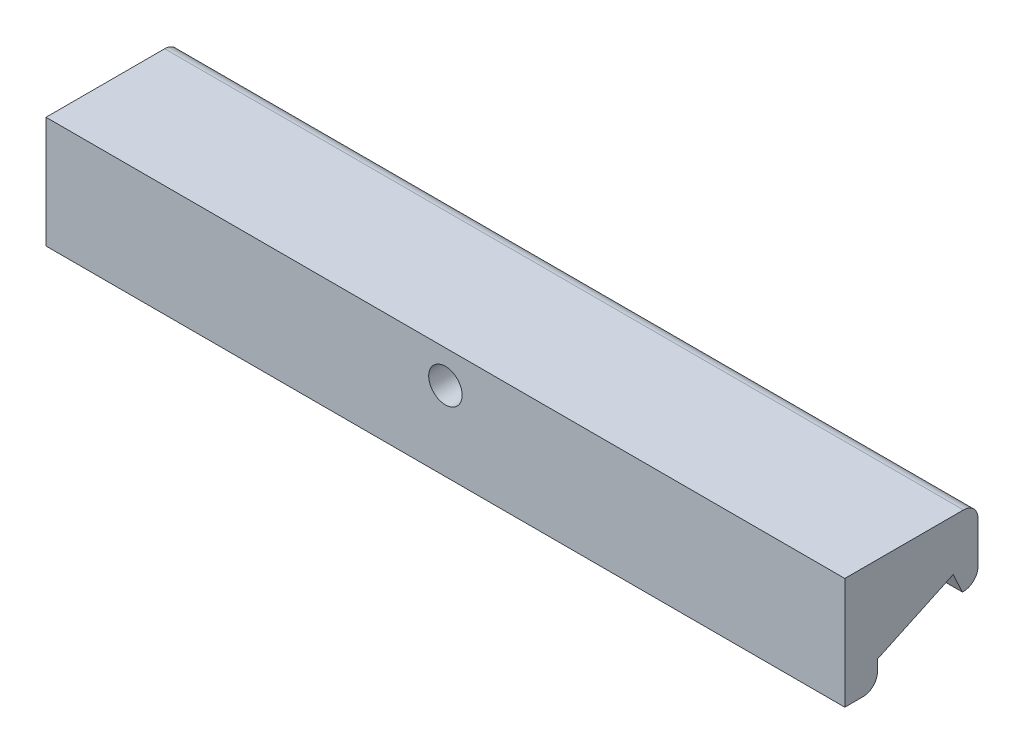
ISO-10303-21;
HEADER;
FILE_DESCRIPTION(('STEP AP214'),'2;1');
FILE_NAME('part.step','',(''),(''),'','','');
FILE_SCHEMA(('AUTOMOTIVE_DESIGN { 1 0 10303 214 1 1 1 1 }'));
ENDSEC;
DATA;
#1=APPLICATION_CONTEXT('core data for automotive mechanical design processes');
#2=APPLICATION_PROTOCOL_DEFINITION('international standard','automotive_design',2000,#1);
#3=PRODUCT_CONTEXT('',#1,'mechanical');
#4=PRODUCT('Part','Part','',(#3));
#5=PRODUCT_RELATED_PRODUCT_CATEGORY('part','',(#4));
#6=PRODUCT_DEFINITION_FORMATION('','',#4);
#7=PRODUCT_DEFINITION_CONTEXT('part definition',#1,'design');
#8=PRODUCT_DEFINITION('design','',#6,#7);
#9=PRODUCT_DEFINITION_SHAPE('','',#8);
#10=(LENGTH_UNIT() NAMED_UNIT(*) SI_UNIT(.MILLI.,.METRE.));
#11=(NAMED_UNIT(*) PLANE_ANGLE_UNIT() SI_UNIT($,.RADIAN.));
#12=(NAMED_UNIT(*) SI_UNIT($,.STERADIAN.) SOLID_ANGLE_UNIT());
#13=UNCERTAINTY_MEASURE_WITH_UNIT(LENGTH_MEASURE(1.E-05),#10,'distance_accuracy_value','');
#14=(GEOMETRIC_REPRESENTATION_CONTEXT(3) GLOBAL_UNCERTAINTY_ASSIGNED_CONTEXT((#13)) GLOBAL_UNIT_ASSIGNED_CONTEXT((#10,
#11,#12)) REPRESENTATION_CONTEXT('',''));
#15=CARTESIAN_POINT('',(0.,0.,0.));
#16=DIRECTION('',(0.,0.,1.));
#17=DIRECTION('',(1.,0.,0.));
#18=AXIS2_PLACEMENT_3D('',#15,#16,#17);
#19=CARTESIAN_POINT('',(110.,15.360110010018,0.));
#20=DIRECTION('',(0.,0.,-1.));
#21=DIRECTION('',(0.,1.,0.));
#22=AXIS2_PLACEMENT_3D('',#19,#20,#21);
#23=PLANE('',#22);
#24=CARTESIAN_POINT('',(55.,10.860110010018,0.));
#25=DIRECTION('',(0.,0.,1.));
#26=DIRECTION('',(1.,0.,0.));
#27=AXIS2_PLACEMENT_3D('',#24,#25,#26);
#28=CIRCLE('',#27,2.3);
#29=CARTESIAN_POINT('',(57.3,10.860110010018,0.));
#30=VERTEX_POINT('',#29);
#31=EDGE_CURVE('E212',#30,#30,#28,.T.);
#32=ORIENTED_EDGE('',*,*,#31,.F.);
#33=EDGE_LOOP('',(#32));
#34=FACE_BOUND('',#33,.T.);
#35=DIRECTION('',(0.,-1.,0.));
#36=VECTOR('',#35,1.);
#37=CARTESIAN_POINT('',(0.,15.360110010018,0.));
#38=LINE('',#37,#36);
#39=CARTESIAN_POINT('',(0.,15.360110010018,0.));
#40=VERTEX_POINT('',#39);
#41=CARTESIAN_POINT('',(0.,0.,0.));
#42=VERTEX_POINT('',#41);
#43=EDGE_CURVE('E146',#40,#42,#38,.T.);
#44=ORIENTED_EDGE('',*,*,#43,.T.);
#45=DIRECTION('',(-1.,0.,0.));
#46=VECTOR('',#45,1.);
#47=CARTESIAN_POINT('',(110.,0.,0.));
#48=LINE('',#47,#46);
#49=CARTESIAN_POINT('',(110.,0.,0.));
#50=VERTEX_POINT('',#49);
#51=EDGE_CURVE('E11',#50,#42,#48,.T.);
#52=ORIENTED_EDGE('',*,*,#51,.F.);
#53=DIRECTION('',(0.,-1.,0.));
#54=VECTOR('',#53,1.);
#55=CARTESIAN_POINT('',(110.,15.360110010018,0.));
#56=LINE('',#55,#54);
#57=CARTESIAN_POINT('',(110.,15.360110010018,0.));
#58=VERTEX_POINT('',#57);
#59=EDGE_CURVE('E165',#58,#50,#56,.T.);
#60=ORIENTED_EDGE('',*,*,#59,.F.);
#61=DIRECTION('',(-1.,0.,0.));
#62=VECTOR('',#61,1.);
#63=CARTESIAN_POINT('',(110.,15.360110010018,0.));
#64=LINE('',#63,#62);
#65=EDGE_CURVE('E142',#58,#40,#64,.T.);
#66=ORIENTED_EDGE('',*,*,#65,.T.);
#67=EDGE_LOOP('',(#44,#52,#60,#66));
#68=FACE_BOUND('',#67,.T.);
#69=ADVANCED_FACE('F38',(#34,#68),#23,.F.);
#70=CARTESIAN_POINT('',(110.,0.,0.));
#71=DIRECTION('',(0.,1.,0.));
#72=DIRECTION('',(0.,0.,1.));
#73=AXIS2_PLACEMENT_3D('',#70,#71,#72);
#74=PLANE('',#73);
#75=DIRECTION('',(0.,0.,-1.));
#76=VECTOR('',#75,1.);
#77=CARTESIAN_POINT('',(0.,0.,0.));
#78=LINE('',#77,#76);
#79=CARTESIAN_POINT('',(0.,0.,-2.4994615533352));
#80=VERTEX_POINT('',#79);
#81=EDGE_CURVE('E149',#42,#80,#78,.T.);
#82=ORIENTED_EDGE('',*,*,#81,.T.);
#83=DIRECTION('',(-1.,0.,0.));
#84=VECTOR('',#83,1.);
#85=CARTESIAN_POINT('',(110.,0.,-2.4994615533352));
#86=LINE('',#85,#84);
#87=CARTESIAN_POINT('',(110.,0.,-2.4994615533352));
#88=VERTEX_POINT('',#87);
#89=EDGE_CURVE('E46',#88,#80,#86,.T.);
#90=ORIENTED_EDGE('',*,*,#89,.F.);
#91=DIRECTION('',(0.,0.,-1.));
#92=VECTOR('',#91,1.);
#93=CARTESIAN_POINT('',(110.,0.,0.));
#94=LINE('',#93,#92);
#95=EDGE_CURVE('E103',#50,#88,#94,.T.);
#96=ORIENTED_EDGE('',*,*,#95,.F.);
#97=ORIENTED_EDGE('',*,*,#51,.T.);
#98=EDGE_LOOP('',(#82,#90,#96,#97));
#99=FACE_BOUND('',#98,.T.);
#100=ADVANCED_FACE('F228',(#99),#74,.F.);
#101=CARTESIAN_POINT('',(110.,2.0005384466648,-2.4994615533352));
#102=DIRECTION('',(-1.,0.,0.));
#103=DIRECTION('',(0.,0.,1.));
#104=AXIS2_PLACEMENT_3D('',#101,#102,#103);
#105=CYLINDRICAL_SURFACE('',#104,2.0005384466648);
#106=CARTESIAN_POINT('',(0.,2.0005384466648,-2.4994615533352));
#107=DIRECTION('',(1.,0.,0.));
#108=DIRECTION('',(0.,0.,-1.));
#109=AXIS2_PLACEMENT_3D('',#106,#107,#108);
#110=CIRCLE('',#109,2.0005384466648);
#111=CARTESIAN_POINT('',(0.,2.0005384466648,-4.5));
#112=VERTEX_POINT('',#111);
#113=EDGE_CURVE('E152',#80,#112,#110,.T.);
#114=ORIENTED_EDGE('',*,*,#113,.T.);
#115=DIRECTION('',(-1.,0.,0.));
#116=VECTOR('',#115,1.);
#117=CARTESIAN_POINT('',(110.,2.0005384466648,-4.5));
#118=LINE('',#117,#116);
#119=CARTESIAN_POINT('',(110.,2.0005384466648,-4.5));
#120=VERTEX_POINT('',#119);
#121=EDGE_CURVE('E178',#120,#112,#118,.T.);
#122=ORIENTED_EDGE('',*,*,#121,.F.);
#123=CARTESIAN_POINT('',(110.,2.0005384466648,-2.4994615533352));
#124=DIRECTION('',(1.,0.,0.));
#125=DIRECTION('',(0.,0.,-1.));
#126=AXIS2_PLACEMENT_3D('',#123,#124,#125);
#127=CIRCLE('',#126,2.0005384466648);
#128=EDGE_CURVE('E186',#88,#120,#127,.T.);
#129=ORIENTED_EDGE('',*,*,#128,.F.);
#130=ORIENTED_EDGE('',*,*,#89,.T.);
#131=EDGE_LOOP('',(#114,#122,#129,#130));
#132=FACE_BOUND('',#131,.T.);
#133=ADVANCED_FACE('F184',(#132),#105,.T.);
#134=CARTESIAN_POINT('',(110.,3.5,-4.5));
#135=DIRECTION('',(0.,0.,1.));
#136=DIRECTION('',(0.,-1.,0.));
#137=AXIS2_PLACEMENT_3D('',#134,#135,#136);
#138=PLANE('',#137);
#139=DIRECTION('',(0.,1.,0.));
#140=VECTOR('',#139,1.);
#141=CARTESIAN_POINT('',(0.,3.5,-4.5));
#142=LINE('',#141,#140);
#143=CARTESIAN_POINT('',(0.,3.5,-4.5));
#144=VERTEX_POINT('',#143);
#145=EDGE_CURVE('E154',#112,#144,#142,.T.);
#146=ORIENTED_EDGE('',*,*,#145,.T.);
#147=DIRECTION('',(-1.,0.,0.));
#148=VECTOR('',#147,1.);
#149=CARTESIAN_POINT('',(110.,3.5,-4.5));
#150=LINE('',#149,#148);
#151=CARTESIAN_POINT('',(110.,3.5,-4.5));
#152=VERTEX_POINT('',#151);
#153=EDGE_CURVE('E175',#152,#144,#150,.T.);
#154=ORIENTED_EDGE('',*,*,#153,.F.);
#155=DIRECTION('',(0.,1.,0.));
#156=VECTOR('',#155,1.);
#157=CARTESIAN_POINT('',(110.,3.5,-4.5));
#158=LINE('',#157,#156);
#159=EDGE_CURVE('E204',#120,#152,#158,.T.);
#160=ORIENTED_EDGE('',*,*,#159,.F.);
#161=ORIENTED_EDGE('',*,*,#121,.T.);
#162=EDGE_LOOP('',(#146,#154,#160,#161));
#163=FACE_BOUND('',#162,.T.);
#164=ADVANCED_FACE('F195',(#163),#138,.F.);
#165=CARTESIAN_POINT('',(110.,8.36011001001802,-14.9225395509215));
#166=DIRECTION('',(0.,0.906307787036651,0.422618261740697));
#167=DIRECTION('',(0.,-0.422618261740697,0.906307787036651));
#168=AXIS2_PLACEMENT_3D('',#165,#166,#167);
#169=PLANE('',#168);
#170=DIRECTION('',(0.,0.422618261740697,-0.906307787036651));
#171=VECTOR('',#170,1.);
#172=CARTESIAN_POINT('',(0.,8.36011001001802,-14.9225395509215));
#173=LINE('',#172,#171);
#174=CARTESIAN_POINT('',(0.,8.36011001001802,-14.9225395509215));
#175=VERTEX_POINT('',#174);
#176=EDGE_CURVE('E156',#144,#175,#173,.T.);
#177=ORIENTED_EDGE('',*,*,#176,.T.);
#178=DIRECTION('',(-1.,0.,0.));
#179=VECTOR('',#178,1.);
#180=CARTESIAN_POINT('',(110.,8.36011001001802,-14.9225395509215));
#181=LINE('',#180,#179);
#182=CARTESIAN_POINT('',(110.,8.36011001001802,-14.9225395509215));
#183=VERTEX_POINT('',#182);
#184=EDGE_CURVE('E172',#183,#175,#181,.T.);
#185=ORIENTED_EDGE('',*,*,#184,.F.);
#186=DIRECTION('',(0.,0.422618261740697,-0.906307787036651));
#187=VECTOR('',#186,1.);
#188=CARTESIAN_POINT('',(110.,8.36011001001802,-14.9225395509215));
#189=LINE('',#188,#187);
#190=EDGE_CURVE('E201',#152,#183,#189,.T.);
#191=ORIENTED_EDGE('',*,*,#190,.F.);
#192=ORIENTED_EDGE('',*,*,#153,.T.);
#193=EDGE_LOOP('',(#177,#185,#191,#192));
#194=FACE_BOUND('',#193,.T.);
#195=ADVANCED_FACE('F199',(#194),#169,.F.);
#196=CARTESIAN_POINT('',(110.,5.64118664890806,-16.1903943361436));
#197=DIRECTION('',(0.,0.422618261740698,-0.906307787036651));
#198=DIRECTION('',(0.,0.906307787036651,0.422618261740698));
#199=AXIS2_PLACEMENT_3D('',#196,#197,#198);
#200=PLANE('',#199);
#201=DIRECTION('',(0.,-0.906307787036651,-0.422618261740698));
#202=VECTOR('',#201,1.);
#203=CARTESIAN_POINT('',(0.,5.64118664890806,-16.1903943361436));
#204=LINE('',#203,#202);
#205=CARTESIAN_POINT('',(0.,5.64118664890806,-16.1903943361436));
#206=VERTEX_POINT('',#205);
#207=EDGE_CURVE('E158',#175,#206,#204,.T.);
#208=ORIENTED_EDGE('',*,*,#207,.T.);
#209=DIRECTION('',(-1.,0.,0.));
#210=VECTOR('',#209,1.);
#211=CARTESIAN_POINT('',(110.,5.64118664890806,-16.1903943361436));
#212=LINE('',#211,#210);
#213=CARTESIAN_POINT('',(110.,5.64118664890806,-16.1903943361436));
#214=VERTEX_POINT('',#213);
#215=EDGE_CURVE('E169',#214,#206,#212,.T.);
#216=ORIENTED_EDGE('',*,*,#215,.F.);
#217=DIRECTION('',(0.,-0.906307787036651,-0.422618261740698));
#218=VECTOR('',#217,1.);
#219=CARTESIAN_POINT('',(110.,5.64118664890806,-16.1903943361436));
#220=LINE('',#219,#218);
#221=EDGE_CURVE('E203',#183,#214,#220,.T.);
#222=ORIENTED_EDGE('',*,*,#221,.F.);
#223=ORIENTED_EDGE('',*,*,#184,.T.);
#224=EDGE_LOOP('',(#208,#216,#222,#223));
#225=FACE_BOUND('',#224,.T.);
#226=ADVANCED_FACE('F236',(#225),#200,.F.);
#227=CARTESIAN_POINT('',(110.,7.63552847711335,-16.3407295358501));
#228=DIRECTION('',(-1.,0.,0.));
#229=DIRECTION('',(0.,0.,1.));
#230=AXIS2_PLACEMENT_3D('',#227,#228,#229);
#231=CYLINDRICAL_SURFACE('',#230,2.);
#232=CARTESIAN_POINT('',(0.,7.63552847711335,-16.3407295358501));
#233=DIRECTION('',(1.,0.,0.));
#234=DIRECTION('',(0.,0.,-1.));
#235=AXIS2_PLACEMENT_3D('',#232,#233,#234);
#236=CIRCLE('',#235,2.);
#237=CARTESIAN_POINT('',(0.,7.63552847711335,-18.3407295358501));
#238=VERTEX_POINT('',#237);
#239=EDGE_CURVE('E160',#206,#238,#236,.T.);
#240=ORIENTED_EDGE('',*,*,#239,.T.);
#241=DIRECTION('',(-1.,0.,0.));
#242=VECTOR('',#241,1.);
#243=CARTESIAN_POINT('',(110.,7.63552847711335,-18.3407295358501));
#244=LINE('',#243,#242);
#245=CARTESIAN_POINT('',(110.,7.63552847711335,-18.3407295358501));
#246=VERTEX_POINT('',#245);
#247=EDGE_CURVE('E137',#246,#238,#244,.T.);
#248=ORIENTED_EDGE('',*,*,#247,.F.);
#249=CARTESIAN_POINT('',(110.,7.63552847711335,-16.3407295358501));
#250=DIRECTION('',(1.,0.,0.));
#251=DIRECTION('',(0.,0.,-1.));
#252=AXIS2_PLACEMENT_3D('',#249,#250,#251);
#253=CIRCLE('',#252,2.);
#254=EDGE_CURVE('E128',#214,#246,#253,.T.);
#255=ORIENTED_EDGE('',*,*,#254,.F.);
#256=ORIENTED_EDGE('',*,*,#215,.T.);
#257=EDGE_LOOP('',(#240,#248,#255,#256));
#258=FACE_BOUND('',#257,.T.);
#259=ADVANCED_FACE('F233',(#258),#231,.T.);
#260=CARTESIAN_POINT('',(110.,7.63552847711335,-18.3407295358501));
#261=DIRECTION('',(0.,0.,1.));
#262=DIRECTION('',(0.,-1.,0.));
#263=AXIS2_PLACEMENT_3D('',#260,#261,#262);
#264=PLANE('',#263);
#265=DIRECTION('',(0.,1.,0.));
#266=VECTOR('',#265,1.);
#267=CARTESIAN_POINT('',(0.,7.63552847711335,-18.3407295358501));
#268=LINE('',#267,#266);
#269=CARTESIAN_POINT('',(0.,13.360110010018,-18.3407295358501));
#270=VERTEX_POINT('',#269);
#271=EDGE_CURVE('E136',#238,#270,#268,.T.);
#272=ORIENTED_EDGE('',*,*,#271,.T.);
#273=DIRECTION('',(-1.,0.,0.));
#274=VECTOR('',#273,1.);
#275=CARTESIAN_POINT('',(110.,13.360110010018,-18.3407295358501));
#276=LINE('',#275,#274);
#277=CARTESIAN_POINT('',(110.,13.360110010018,-18.3407295358501));
#278=VERTEX_POINT('',#277);
#279=EDGE_CURVE('E133',#278,#270,#276,.T.);
#280=ORIENTED_EDGE('',*,*,#279,.F.);
#281=DIRECTION('',(0.,1.,0.));
#282=VECTOR('',#281,1.);
#283=CARTESIAN_POINT('',(110.,7.63552847711335,-18.3407295358501));
#284=LINE('',#283,#282);
#285=EDGE_CURVE('E122',#246,#278,#284,.T.);
#286=ORIENTED_EDGE('',*,*,#285,.F.);
#287=ORIENTED_EDGE('',*,*,#247,.T.);
#288=EDGE_LOOP('',(#272,#280,#286,#287));
#289=FACE_BOUND('',#288,.T.);
#290=ADVANCED_FACE('F134',(#289),#264,.F.);
#291=CARTESIAN_POINT('',(110.,13.360110010018,-16.3407295358501));
#292=DIRECTION('',(-1.,0.,0.));
#293=DIRECTION('',(0.,0.,1.));
#294=AXIS2_PLACEMENT_3D('',#291,#292,#293);
#295=CYLINDRICAL_SURFACE('',#294,2.);
#296=CARTESIAN_POINT('',(0.,13.360110010018,-16.3407295358501));
#297=DIRECTION('',(1.,0.,0.));
#298=DIRECTION('',(0.,0.,1.));
#299=AXIS2_PLACEMENT_3D('',#296,#297,#298);
#300=CIRCLE('',#299,2.);
#301=CARTESIAN_POINT('',(0.,15.360110010018,-16.3407295358501));
#302=VERTEX_POINT('',#301);
#303=EDGE_CURVE('E89',#270,#302,#300,.T.);
#304=ORIENTED_EDGE('',*,*,#303,.T.);
#305=DIRECTION('',(-1.,0.,0.));
#306=VECTOR('',#305,1.);
#307=CARTESIAN_POINT('',(110.,15.360110010018,-16.3407295358501));
#308=LINE('',#307,#306);
#309=CARTESIAN_POINT('',(110.,15.360110010018,-16.3407295358501));
#310=VERTEX_POINT('',#309);
#311=EDGE_CURVE('E138',#310,#302,#308,.T.);
#312=ORIENTED_EDGE('',*,*,#311,.F.);
#313=CARTESIAN_POINT('',(110.,13.360110010018,-16.3407295358501));
#314=DIRECTION('',(1.,0.,0.));
#315=DIRECTION('',(0.,0.,1.));
#316=AXIS2_PLACEMENT_3D('',#313,#314,#315);
#317=CIRCLE('',#316,2.);
#318=EDGE_CURVE('E126',#278,#310,#317,.T.);
#319=ORIENTED_EDGE('',*,*,#318,.F.);
#320=ORIENTED_EDGE('',*,*,#279,.T.);
#321=EDGE_LOOP('',(#304,#312,#319,#320));
#322=FACE_BOUND('',#321,.T.);
#323=ADVANCED_FACE('F140',(#322),#295,.T.);
#324=CARTESIAN_POINT('',(110.,15.360110010018,-16.3407295358501));
#325=DIRECTION('',(0.,-1.,0.));
#326=DIRECTION('',(0.,0.,-1.));
#327=AXIS2_PLACEMENT_3D('',#324,#325,#326);
#328=PLANE('',#327);
#329=DIRECTION('',(0.,0.,1.));
#330=VECTOR('',#329,1.);
#331=CARTESIAN_POINT('',(0.,15.360110010018,-16.3407295358501));
#332=LINE('',#331,#330);
#333=EDGE_CURVE('E95',#302,#40,#332,.T.);
#334=ORIENTED_EDGE('',*,*,#333,.T.);
#335=ORIENTED_EDGE('',*,*,#65,.F.);
#336=DIRECTION('',(0.,0.,1.));
#337=VECTOR('',#336,1.);
#338=CARTESIAN_POINT('',(110.,15.360110010018,-16.3407295358501));
#339=LINE('',#338,#337);
#340=EDGE_CURVE('E54',#310,#58,#339,.T.);
#341=ORIENTED_EDGE('',*,*,#340,.F.);
#342=ORIENTED_EDGE('',*,*,#311,.T.);
#343=EDGE_LOOP('',(#334,#335,#341,#342));
#344=FACE_BOUND('',#343,.T.);
#345=ADVANCED_FACE('F296',(#344),#328,.F.);
#346=CARTESIAN_POINT('',(110.,2.0005384466648,-2.4994615533352));
#347=DIRECTION('',(1.,0.,0.));
#348=DIRECTION('',(0.,0.,-1.));
#349=AXIS2_PLACEMENT_3D('',#346,#347,#348);
#350=PLANE('',#349);
#351=ORIENTED_EDGE('',*,*,#59,.T.);
#352=ORIENTED_EDGE('',*,*,#95,.T.);
#353=ORIENTED_EDGE('',*,*,#128,.T.);
#354=ORIENTED_EDGE('',*,*,#159,.T.);
#355=ORIENTED_EDGE('',*,*,#190,.T.);
#356=ORIENTED_EDGE('',*,*,#221,.T.);
#357=ORIENTED_EDGE('',*,*,#254,.T.);
#358=ORIENTED_EDGE('',*,*,#285,.T.);
#359=ORIENTED_EDGE('',*,*,#318,.T.);
#360=ORIENTED_EDGE('',*,*,#340,.T.);
#361=EDGE_LOOP('',(#351,#352,#353,#354,#355,#356,#357,#358,#359,#360));
#362=FACE_BOUND('',#361,.T.);
#363=ADVANCED_FACE('F124',(#362),#350,.T.);
#364=CARTESIAN_POINT('',(0.,2.0005384466648,-2.4994615533352));
#365=DIRECTION('',(1.,0.,0.));
#366=DIRECTION('',(0.,0.,-1.));
#367=AXIS2_PLACEMENT_3D('',#364,#365,#366);
#368=PLANE('',#367);
#369=ORIENTED_EDGE('',*,*,#43,.F.);
#370=ORIENTED_EDGE('',*,*,#333,.F.);
#371=ORIENTED_EDGE('',*,*,#303,.F.);
#372=ORIENTED_EDGE('',*,*,#271,.F.);
#373=ORIENTED_EDGE('',*,*,#239,.F.);
#374=ORIENTED_EDGE('',*,*,#207,.F.);
#375=ORIENTED_EDGE('',*,*,#176,.F.);
#376=ORIENTED_EDGE('',*,*,#145,.F.);
#377=ORIENTED_EDGE('',*,*,#113,.F.);
#378=ORIENTED_EDGE('',*,*,#81,.F.);
#379=EDGE_LOOP('',(#369,#370,#371,#372,#373,#374,#375,#376,#377,#378));
#380=FACE_BOUND('',#379,.T.);
#381=ADVANCED_FACE('F190',(#380),#368,.F.);
#382=CARTESIAN_POINT('',(55.,10.860110010018,-4.5));
#383=DIRECTION('',(0.,0.,1.));
#384=DIRECTION('',(1.,0.,0.));
#385=AXIS2_PLACEMENT_3D('',#382,#383,#384);
#386=CYLINDRICAL_SURFACE('',#385,2.3);
#387=CARTESIAN_POINT('',(55.,10.860110010018,-4.5));
#388=DIRECTION('',(0.,0.,1.));
#389=DIRECTION('',(1.,0.,0.));
#390=AXIS2_PLACEMENT_3D('',#387,#388,#389);
#391=CIRCLE('',#390,2.3);
#392=CARTESIAN_POINT('',(57.3,10.860110010018,-4.5));
#393=VERTEX_POINT('',#392);
#394=EDGE_CURVE('E150',#393,#393,#391,.T.);
#395=ORIENTED_EDGE('',*,*,#394,.F.);
#396=EDGE_LOOP('',(#395));
#397=FACE_BOUND('',#396,.T.);
#398=ORIENTED_EDGE('',*,*,#31,.T.);
#399=EDGE_LOOP('',(#398));
#400=FACE_BOUND('',#399,.T.);
#401=ADVANCED_FACE('F220',(#397,#400),#386,.F.);
#402=CARTESIAN_POINT('',(55.,10.860110010018,-4.5));
#403=DIRECTION('',(0.,0.,1.));
#404=DIRECTION('',(1.,0.,0.));
#405=AXIS2_PLACEMENT_3D('',#402,#403,#404);
#406=PLANE('',#405);
#407=ORIENTED_EDGE('',*,*,#394,.T.);
#408=EDGE_LOOP('',(#407));
#409=FACE_BOUND('',#408,.T.);
#410=ADVANCED_FACE('F218',(#409),#406,.T.);
#411=CLOSED_SHELL('',(#69,#100,#133,#164,#195,#226,#259,#290,#323,#345,#363,#381,#401,#410));
#412=MANIFOLD_SOLID_BREP('B2',#411);
#413=ADVANCED_BREP_SHAPE_REPRESENTATION('',(#18,#412),#14);
#414=SHAPE_DEFINITION_REPRESENTATION(#9,#413);
ENDSEC;
END-ISO-10303-21;
